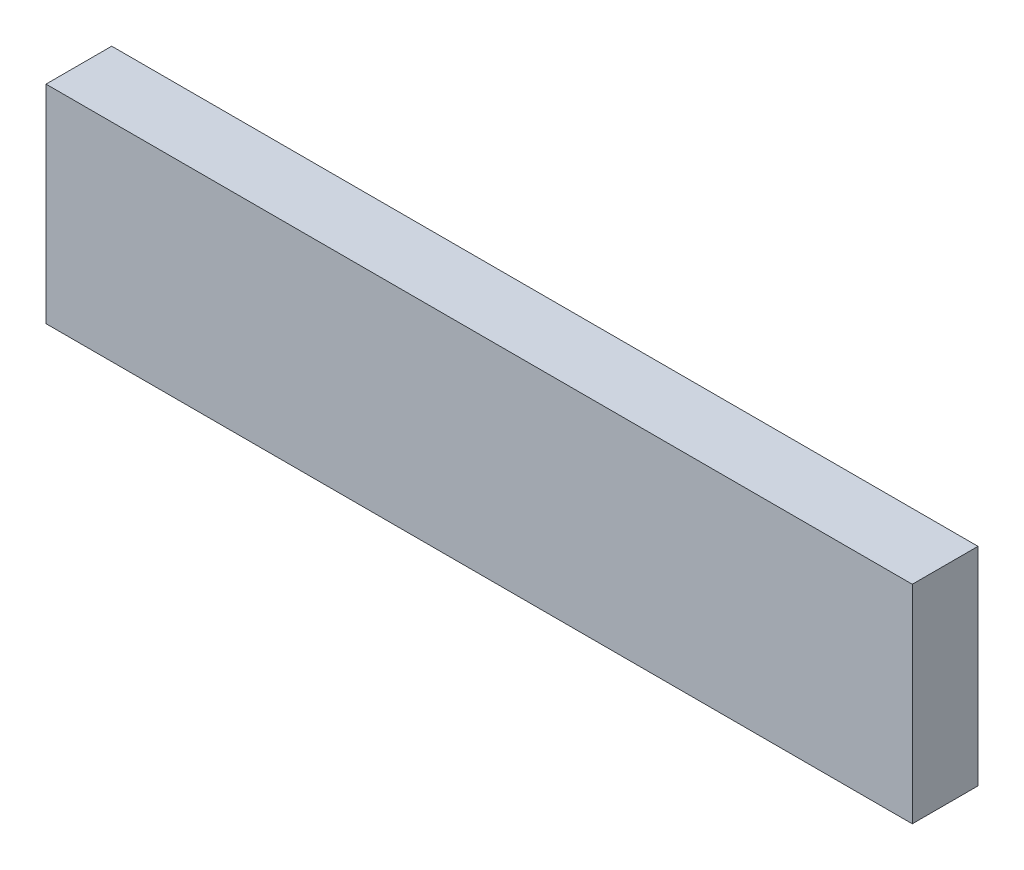
ISO-10303-21;
HEADER;
FILE_DESCRIPTION(('STEP AP214'),'2;1');
FILE_NAME('part.step','',(''),(''),'','','');
FILE_SCHEMA(('AUTOMOTIVE_DESIGN { 1 0 10303 214 1 1 1 1 }'));
ENDSEC;
DATA;
#1=APPLICATION_CONTEXT('core data for automotive mechanical design processes');
#2=APPLICATION_PROTOCOL_DEFINITION('international standard','automotive_design',2000,#1);
#3=PRODUCT_CONTEXT('',#1,'mechanical');
#4=PRODUCT('Part','Part','',(#3));
#5=PRODUCT_RELATED_PRODUCT_CATEGORY('part','',(#4));
#6=PRODUCT_DEFINITION_FORMATION('','',#4);
#7=PRODUCT_DEFINITION_CONTEXT('part definition',#1,'design');
#8=PRODUCT_DEFINITION('design','',#6,#7);
#9=PRODUCT_DEFINITION_SHAPE('','',#8);
#10=(LENGTH_UNIT() NAMED_UNIT(*) SI_UNIT(.MILLI.,.METRE.));
#11=(NAMED_UNIT(*) PLANE_ANGLE_UNIT() SI_UNIT($,.RADIAN.));
#12=(NAMED_UNIT(*) SI_UNIT($,.STERADIAN.) SOLID_ANGLE_UNIT());
#13=UNCERTAINTY_MEASURE_WITH_UNIT(LENGTH_MEASURE(1.E-05),#10,'distance_accuracy_value','');
#14=(GEOMETRIC_REPRESENTATION_CONTEXT(3) GLOBAL_UNCERTAINTY_ASSIGNED_CONTEXT((#13)) GLOBAL_UNIT_ASSIGNED_CONTEXT((#10,
#11,#12)) REPRESENTATION_CONTEXT('',''));
#15=CARTESIAN_POINT('',(0.,0.,0.));
#16=DIRECTION('',(0.,0.,1.));
#17=DIRECTION('',(1.,0.,0.));
#18=AXIS2_PLACEMENT_3D('',#15,#16,#17);
#19=CARTESIAN_POINT('',(-2.505,0.59999999999999,-0.190000000000001));
#20=DIRECTION('',(0.,0.,1.));
#21=DIRECTION('',(0.,-1.,0.));
#22=AXIS2_PLACEMENT_3D('',#19,#20,#21);
#23=PLANE('',#22);
#24=DIRECTION('',(0.,-1.,0.));
#25=VECTOR('',#24,1.);
#26=CARTESIAN_POINT('',(2.505,0.59999999999999,-0.190000000000001));
#27=LINE('',#26,#25);
#28=CARTESIAN_POINT('',(2.505,0.59999999999999,-0.190000000000001));
#29=VERTEX_POINT('',#28);
#30=CARTESIAN_POINT('',(2.505,-0.599999999999989,-0.190000000000001));
#31=VERTEX_POINT('',#30);
#32=EDGE_CURVE('E102',#29,#31,#27,.T.);
#33=ORIENTED_EDGE('',*,*,#32,.T.);
#34=DIRECTION('',(1.,0.,0.));
#35=VECTOR('',#34,1.);
#36=CARTESIAN_POINT('',(-2.505,-0.599999999999989,-0.190000000000001));
#37=LINE('',#36,#35);
#38=CARTESIAN_POINT('',(-2.505,-0.599999999999989,-0.190000000000001));
#39=VERTEX_POINT('',#38);
#40=EDGE_CURVE('E11',#39,#31,#37,.T.);
#41=ORIENTED_EDGE('',*,*,#40,.F.);
#42=DIRECTION('',(0.,-1.,0.));
#43=VECTOR('',#42,1.);
#44=CARTESIAN_POINT('',(-2.505,0.59999999999999,-0.190000000000001));
#45=LINE('',#44,#43);
#46=CARTESIAN_POINT('',(-2.505,0.59999999999999,-0.190000000000001));
#47=VERTEX_POINT('',#46);
#48=EDGE_CURVE('E90',#47,#39,#45,.T.);
#49=ORIENTED_EDGE('',*,*,#48,.F.);
#50=DIRECTION('',(1.,0.,0.));
#51=VECTOR('',#50,1.);
#52=CARTESIAN_POINT('',(-2.505,0.59999999999999,-0.190000000000001));
#53=LINE('',#52,#51);
#54=EDGE_CURVE('E98',#47,#29,#53,.T.);
#55=ORIENTED_EDGE('',*,*,#54,.T.);
#56=EDGE_LOOP('',(#33,#41,#49,#55));
#57=FACE_BOUND('',#56,.T.);
#58=ADVANCED_FACE('F39',(#57),#23,.F.);
#59=CARTESIAN_POINT('',(-2.505,-0.599999999999989,-0.190000000000001));
#60=DIRECTION('',(0.,1.,0.));
#61=DIRECTION('',(0.,0.,1.));
#62=AXIS2_PLACEMENT_3D('',#59,#60,#61);
#63=PLANE('',#62);
#64=DIRECTION('',(0.,0.,1.));
#65=VECTOR('',#64,1.);
#66=CARTESIAN_POINT('',(2.505,-0.599999999999989,-0.190000000000001));
#67=LINE('',#66,#65);
#68=CARTESIAN_POINT('',(2.505,-0.599999999999989,0.190000000000001));
#69=VERTEX_POINT('',#68);
#70=EDGE_CURVE('E94',#31,#69,#67,.T.);
#71=ORIENTED_EDGE('',*,*,#70,.T.);
#72=DIRECTION('',(1.,0.,0.));
#73=VECTOR('',#72,1.);
#74=CARTESIAN_POINT('',(-2.505,-0.599999999999989,0.190000000000001));
#75=LINE('',#74,#73);
#76=CARTESIAN_POINT('',(-2.505,-0.599999999999989,0.190000000000001));
#77=VERTEX_POINT('',#76);
#78=EDGE_CURVE('E47',#77,#69,#75,.T.);
#79=ORIENTED_EDGE('',*,*,#78,.F.);
#80=DIRECTION('',(0.,0.,1.));
#81=VECTOR('',#80,1.);
#82=CARTESIAN_POINT('',(-2.505,-0.599999999999989,-0.190000000000001));
#83=LINE('',#82,#81);
#84=EDGE_CURVE('E85',#39,#77,#83,.T.);
#85=ORIENTED_EDGE('',*,*,#84,.F.);
#86=ORIENTED_EDGE('',*,*,#40,.T.);
#87=EDGE_LOOP('',(#71,#79,#85,#86));
#88=FACE_BOUND('',#87,.T.);
#89=ADVANCED_FACE('F93',(#88),#63,.F.);
#90=CARTESIAN_POINT('',(-2.505,0.59999999999999,0.190000000000001));
#91=DIRECTION('',(0.,0.,-1.));
#92=DIRECTION('',(0.,1.,0.));
#93=AXIS2_PLACEMENT_3D('',#90,#91,#92);
#94=PLANE('',#93);
#95=DIRECTION('',(0.,1.,0.));
#96=VECTOR('',#95,1.);
#97=CARTESIAN_POINT('',(2.505,0.59999999999999,0.190000000000001));
#98=LINE('',#97,#96);
#99=CARTESIAN_POINT('',(2.505,0.59999999999999,0.190000000000001));
#100=VERTEX_POINT('',#99);
#101=EDGE_CURVE('E72',#69,#100,#98,.T.);
#102=ORIENTED_EDGE('',*,*,#101,.T.);
#103=DIRECTION('',(1.,0.,0.));
#104=VECTOR('',#103,1.);
#105=CARTESIAN_POINT('',(-2.505,0.59999999999999,0.190000000000001));
#106=LINE('',#105,#104);
#107=CARTESIAN_POINT('',(-2.505,0.59999999999999,0.190000000000001));
#108=VERTEX_POINT('',#107);
#109=EDGE_CURVE('E95',#108,#100,#106,.T.);
#110=ORIENTED_EDGE('',*,*,#109,.F.);
#111=DIRECTION('',(0.,1.,0.));
#112=VECTOR('',#111,1.);
#113=CARTESIAN_POINT('',(-2.505,0.59999999999999,0.190000000000001));
#114=LINE('',#113,#112);
#115=EDGE_CURVE('E88',#77,#108,#114,.T.);
#116=ORIENTED_EDGE('',*,*,#115,.F.);
#117=ORIENTED_EDGE('',*,*,#78,.T.);
#118=EDGE_LOOP('',(#102,#110,#116,#117));
#119=FACE_BOUND('',#118,.T.);
#120=ADVANCED_FACE('F96',(#119),#94,.F.);
#121=CARTESIAN_POINT('',(-2.505,0.59999999999999,-0.190000000000001));
#122=DIRECTION('',(0.,-1.,0.));
#123=DIRECTION('',(0.,0.,-1.));
#124=AXIS2_PLACEMENT_3D('',#121,#122,#123);
#125=PLANE('',#124);
#126=DIRECTION('',(0.,0.,-1.));
#127=VECTOR('',#126,1.);
#128=CARTESIAN_POINT('',(2.505,0.59999999999999,-0.190000000000001));
#129=LINE('',#128,#127);
#130=EDGE_CURVE('E78',#100,#29,#129,.T.);
#131=ORIENTED_EDGE('',*,*,#130,.T.);
#132=ORIENTED_EDGE('',*,*,#54,.F.);
#133=DIRECTION('',(0.,0.,-1.));
#134=VECTOR('',#133,1.);
#135=CARTESIAN_POINT('',(-2.505,0.59999999999999,-0.190000000000001));
#136=LINE('',#135,#134);
#137=EDGE_CURVE('E55',#108,#47,#136,.T.);
#138=ORIENTED_EDGE('',*,*,#137,.F.);
#139=ORIENTED_EDGE('',*,*,#109,.T.);
#140=EDGE_LOOP('',(#131,#132,#138,#139));
#141=FACE_BOUND('',#140,.T.);
#142=ADVANCED_FACE('F109',(#141),#125,.F.);
#143=CARTESIAN_POINT('',(-2.505,0.,0.));
#144=DIRECTION('',(-1.,0.,0.));
#145=DIRECTION('',(0.,0.,1.));
#146=AXIS2_PLACEMENT_3D('',#143,#144,#145);
#147=PLANE('',#146);
#148=ORIENTED_EDGE('',*,*,#48,.T.);
#149=ORIENTED_EDGE('',*,*,#84,.T.);
#150=ORIENTED_EDGE('',*,*,#115,.T.);
#151=ORIENTED_EDGE('',*,*,#137,.T.);
#152=EDGE_LOOP('',(#148,#149,#150,#151));
#153=FACE_BOUND('',#152,.T.);
#154=ADVANCED_FACE('F86',(#153),#147,.T.);
#155=CARTESIAN_POINT('',(2.505,0.,0.));
#156=DIRECTION('',(-1.,0.,0.));
#157=DIRECTION('',(0.,0.,1.));
#158=AXIS2_PLACEMENT_3D('',#155,#156,#157);
#159=PLANE('',#158);
#160=ORIENTED_EDGE('',*,*,#32,.F.);
#161=ORIENTED_EDGE('',*,*,#130,.F.);
#162=ORIENTED_EDGE('',*,*,#101,.F.);
#163=ORIENTED_EDGE('',*,*,#70,.F.);
#164=EDGE_LOOP('',(#160,#161,#162,#163));
#165=FACE_BOUND('',#164,.T.);
#166=ADVANCED_FACE('F112',(#165),#159,.F.);
#167=CLOSED_SHELL('',(#58,#89,#120,#142,#154,#166));
#168=MANIFOLD_SOLID_BREP('B2',#167);
#169=ADVANCED_BREP_SHAPE_REPRESENTATION('',(#18,#168),#14);
#170=SHAPE_DEFINITION_REPRESENTATION(#9,#169);
ENDSEC;
END-ISO-10303-21;
